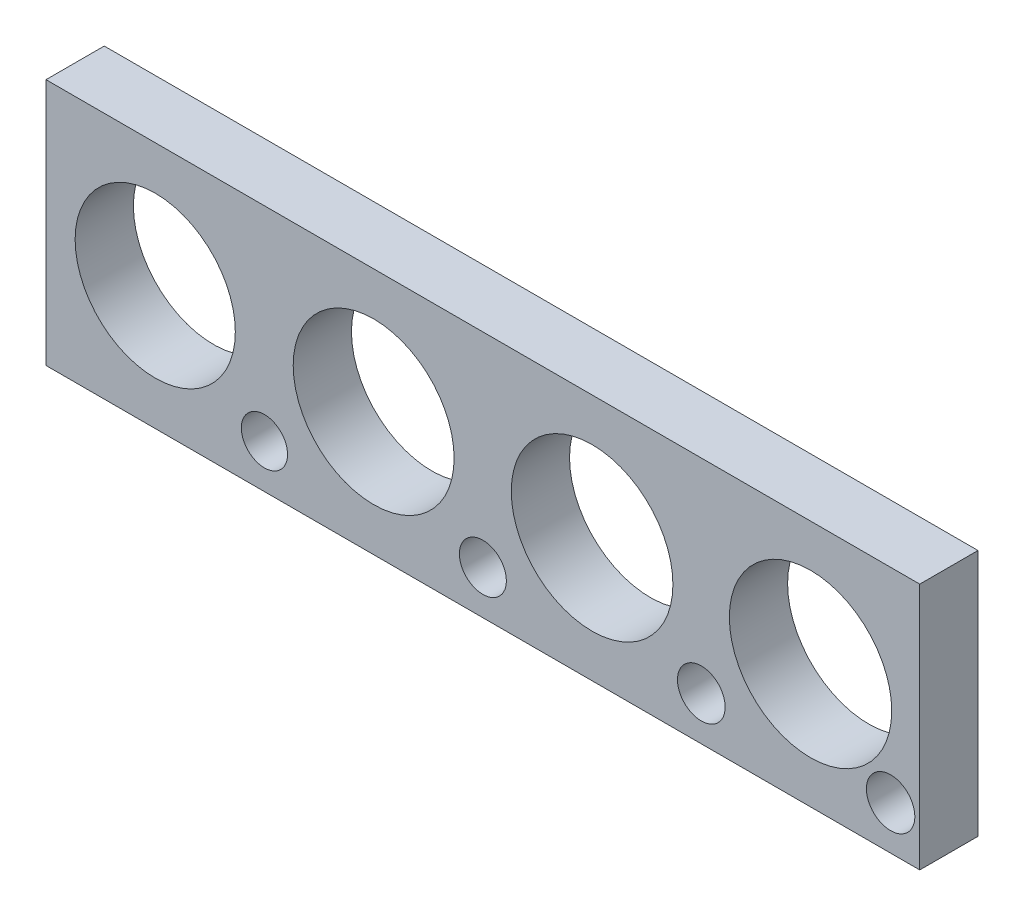
ISO-10303-21;
HEADER;
FILE_DESCRIPTION(('STEP AP214'),'2;1');
FILE_NAME('part.step','',(''),(''),'','','');
FILE_SCHEMA(('AUTOMOTIVE_DESIGN { 1 0 10303 214 1 1 1 1 }'));
ENDSEC;
DATA;
#1=APPLICATION_CONTEXT('core data for automotive mechanical design processes');
#2=APPLICATION_PROTOCOL_DEFINITION('international standard','automotive_design',2000,#1);
#3=PRODUCT_CONTEXT('',#1,'mechanical');
#4=PRODUCT('Part','Part','',(#3));
#5=PRODUCT_RELATED_PRODUCT_CATEGORY('part','',(#4));
#6=PRODUCT_DEFINITION_FORMATION('','',#4);
#7=PRODUCT_DEFINITION_CONTEXT('part definition',#1,'design');
#8=PRODUCT_DEFINITION('design','',#6,#7);
#9=PRODUCT_DEFINITION_SHAPE('','',#8);
#10=(LENGTH_UNIT() NAMED_UNIT(*) SI_UNIT(.MILLI.,.METRE.));
#11=(NAMED_UNIT(*) PLANE_ANGLE_UNIT() SI_UNIT($,.RADIAN.));
#12=(NAMED_UNIT(*) SI_UNIT($,.STERADIAN.) SOLID_ANGLE_UNIT());
#13=UNCERTAINTY_MEASURE_WITH_UNIT(LENGTH_MEASURE(1.E-05),#10,'distance_accuracy_value','');
#14=(GEOMETRIC_REPRESENTATION_CONTEXT(3) GLOBAL_UNCERTAINTY_ASSIGNED_CONTEXT((#13)) GLOBAL_UNIT_ASSIGNED_CONTEXT((#10,
#11,#12)) REPRESENTATION_CONTEXT('',''));
#15=CARTESIAN_POINT('',(0.,0.,0.));
#16=DIRECTION('',(0.,0.,1.));
#17=DIRECTION('',(1.,0.,0.));
#18=AXIS2_PLACEMENT_3D('',#15,#16,#17);
#19=CARTESIAN_POINT('',(-60.,-17.,8.));
#20=DIRECTION('',(1.,0.,0.));
#21=DIRECTION('',(0.,0.,-1.));
#22=AXIS2_PLACEMENT_3D('',#19,#20,#21);
#23=PLANE('',#22);
#24=DIRECTION('',(0.,-1.,0.));
#25=VECTOR('',#24,1.);
#26=CARTESIAN_POINT('',(-60.,-17.,0.));
#27=LINE('',#26,#25);
#28=CARTESIAN_POINT('',(-60.,17.,0.));
#29=VERTEX_POINT('',#28);
#30=CARTESIAN_POINT('',(-60.,-17.,0.));
#31=VERTEX_POINT('',#30);
#32=EDGE_CURVE('E116',#29,#31,#27,.T.);
#33=ORIENTED_EDGE('',*,*,#32,.T.);
#34=DIRECTION('',(0.,0.,-1.));
#35=VECTOR('',#34,1.);
#36=CARTESIAN_POINT('',(-60.,-17.,8.));
#37=LINE('',#36,#35);
#38=CARTESIAN_POINT('',(-60.,-17.,8.));
#39=VERTEX_POINT('',#38);
#40=EDGE_CURVE('E11',#39,#31,#37,.T.);
#41=ORIENTED_EDGE('',*,*,#40,.F.);
#42=DIRECTION('',(0.,-1.,0.));
#43=VECTOR('',#42,1.);
#44=CARTESIAN_POINT('',(-60.,-17.,8.));
#45=LINE('',#44,#43);
#46=CARTESIAN_POINT('',(-60.,17.,8.));
#47=VERTEX_POINT('',#46);
#48=EDGE_CURVE('E97',#47,#39,#45,.T.);
#49=ORIENTED_EDGE('',*,*,#48,.F.);
#50=DIRECTION('',(0.,0.,-1.));
#51=VECTOR('',#50,1.);
#52=CARTESIAN_POINT('',(-60.,17.,8.));
#53=LINE('',#52,#51);
#54=EDGE_CURVE('E115',#47,#29,#53,.T.);
#55=ORIENTED_EDGE('',*,*,#54,.T.);
#56=EDGE_LOOP('',(#33,#41,#49,#55));
#57=FACE_BOUND('',#56,.T.);
#58=ADVANCED_FACE('F44',(#57),#23,.F.);
#59=CARTESIAN_POINT('',(-60.,-17.,8.));
#60=DIRECTION('',(0.,1.,0.));
#61=DIRECTION('',(0.,0.,1.));
#62=AXIS2_PLACEMENT_3D('',#59,#60,#61);
#63=PLANE('',#62);
#64=DIRECTION('',(1.,0.,0.));
#65=VECTOR('',#64,1.);
#66=CARTESIAN_POINT('',(-60.,-17.,0.));
#67=LINE('',#66,#65);
#68=CARTESIAN_POINT('',(60.,-17.,0.));
#69=VERTEX_POINT('',#68);
#70=EDGE_CURVE('E102',#31,#69,#67,.T.);
#71=ORIENTED_EDGE('',*,*,#70,.T.);
#72=DIRECTION('',(0.,0.,-1.));
#73=VECTOR('',#72,1.);
#74=CARTESIAN_POINT('',(60.,-17.,8.));
#75=LINE('',#74,#73);
#76=CARTESIAN_POINT('',(60.,-17.,8.));
#77=VERTEX_POINT('',#76);
#78=EDGE_CURVE('E54',#77,#69,#75,.T.);
#79=ORIENTED_EDGE('',*,*,#78,.F.);
#80=DIRECTION('',(1.,0.,0.));
#81=VECTOR('',#80,1.);
#82=CARTESIAN_POINT('',(-60.,-17.,8.));
#83=LINE('',#82,#81);
#84=EDGE_CURVE('E94',#39,#77,#83,.T.);
#85=ORIENTED_EDGE('',*,*,#84,.F.);
#86=ORIENTED_EDGE('',*,*,#40,.T.);
#87=EDGE_LOOP('',(#71,#79,#85,#86));
#88=FACE_BOUND('',#87,.T.);
#89=ADVANCED_FACE('F103',(#88),#63,.F.);
#90=CARTESIAN_POINT('',(60.,-17.,8.));
#91=DIRECTION('',(-1.,0.,0.));
#92=DIRECTION('',(0.,0.,1.));
#93=AXIS2_PLACEMENT_3D('',#90,#91,#92);
#94=PLANE('',#93);
#95=DIRECTION('',(0.,1.,0.));
#96=VECTOR('',#95,1.);
#97=CARTESIAN_POINT('',(60.,-17.,0.));
#98=LINE('',#97,#96);
#99=CARTESIAN_POINT('',(60.,17.,0.));
#100=VERTEX_POINT('',#99);
#101=EDGE_CURVE('E83',#69,#100,#98,.T.);
#102=ORIENTED_EDGE('',*,*,#101,.T.);
#103=DIRECTION('',(0.,0.,-1.));
#104=VECTOR('',#103,1.);
#105=CARTESIAN_POINT('',(60.,17.,8.));
#106=LINE('',#105,#104);
#107=CARTESIAN_POINT('',(60.,17.,8.));
#108=VERTEX_POINT('',#107);
#109=EDGE_CURVE('E106',#108,#100,#106,.T.);
#110=ORIENTED_EDGE('',*,*,#109,.F.);
#111=DIRECTION('',(0.,1.,0.));
#112=VECTOR('',#111,1.);
#113=CARTESIAN_POINT('',(60.,-17.,8.));
#114=LINE('',#113,#112);
#115=EDGE_CURVE('E100',#77,#108,#114,.T.);
#116=ORIENTED_EDGE('',*,*,#115,.F.);
#117=ORIENTED_EDGE('',*,*,#78,.T.);
#118=EDGE_LOOP('',(#102,#110,#116,#117));
#119=FACE_BOUND('',#118,.T.);
#120=ADVANCED_FACE('F107',(#119),#94,.F.);
#121=CARTESIAN_POINT('',(-60.,17.,8.));
#122=DIRECTION('',(0.,-1.,0.));
#123=DIRECTION('',(0.,0.,-1.));
#124=AXIS2_PLACEMENT_3D('',#121,#122,#123);
#125=PLANE('',#124);
#126=DIRECTION('',(-1.,0.,0.));
#127=VECTOR('',#126,1.);
#128=CARTESIAN_POINT('',(-60.,17.,0.));
#129=LINE('',#128,#127);
#130=EDGE_CURVE('E87',#100,#29,#129,.T.);
#131=ORIENTED_EDGE('',*,*,#130,.T.);
#132=ORIENTED_EDGE('',*,*,#54,.F.);
#133=DIRECTION('',(-1.,0.,0.));
#134=VECTOR('',#133,1.);
#135=CARTESIAN_POINT('',(-60.,17.,8.));
#136=LINE('',#135,#134);
#137=EDGE_CURVE('E63',#108,#47,#136,.T.);
#138=ORIENTED_EDGE('',*,*,#137,.F.);
#139=ORIENTED_EDGE('',*,*,#109,.T.);
#140=EDGE_LOOP('',(#131,#132,#138,#139));
#141=FACE_BOUND('',#140,.T.);
#142=ADVANCED_FACE('F206',(#141),#125,.F.);
#143=CARTESIAN_POINT('',(0.,0.,8.));
#144=DIRECTION('',(0.,0.,-1.));
#145=DIRECTION('',(-1.,0.,0.));
#146=AXIS2_PLACEMENT_3D('',#143,#144,#145);
#147=PLANE('',#146);
#148=CARTESIAN_POINT('',(-30.,-11.,8.));
#149=DIRECTION('',(0.,0.,1.));
#150=DIRECTION('',(1.,0.,0.));
#151=AXIS2_PLACEMENT_3D('',#148,#149,#150);
#152=CIRCLE('',#151,3.175);
#153=CARTESIAN_POINT('',(-26.825,-11.,8.));
#154=VERTEX_POINT('',#153);
#155=EDGE_CURVE('E155',#154,#154,#152,.T.);
#156=ORIENTED_EDGE('',*,*,#155,.F.);
#157=EDGE_LOOP('',(#156));
#158=FACE_BOUND('',#157,.T.);
#159=CARTESIAN_POINT('',(0.,-11.,8.));
#160=DIRECTION('',(0.,0.,1.));
#161=DIRECTION('',(1.,0.,0.));
#162=AXIS2_PLACEMENT_3D('',#159,#160,#161);
#163=CIRCLE('',#162,3.225);
#164=CARTESIAN_POINT('',(3.225,-11.,8.));
#165=VERTEX_POINT('',#164);
#166=EDGE_CURVE('E191',#165,#165,#163,.T.);
#167=ORIENTED_EDGE('',*,*,#166,.F.);
#168=EDGE_LOOP('',(#167));
#169=FACE_BOUND('',#168,.T.);
#170=CARTESIAN_POINT('',(30.,-11.,8.));
#171=DIRECTION('',(0.,0.,1.));
#172=DIRECTION('',(1.,0.,0.));
#173=AXIS2_PLACEMENT_3D('',#170,#171,#172);
#174=CIRCLE('',#173,3.275);
#175=CARTESIAN_POINT('',(33.275,-11.,8.));
#176=VERTEX_POINT('',#175);
#177=EDGE_CURVE('E188',#176,#176,#174,.T.);
#178=ORIENTED_EDGE('',*,*,#177,.F.);
#179=EDGE_LOOP('',(#178));
#180=FACE_BOUND('',#179,.T.);
#181=CARTESIAN_POINT('',(56.,-11.,8.));
#182=DIRECTION('',(0.,0.,1.));
#183=DIRECTION('',(1.,0.,0.));
#184=AXIS2_PLACEMENT_3D('',#181,#182,#183);
#185=CIRCLE('',#184,3.325);
#186=CARTESIAN_POINT('',(59.325,-11.,8.));
#187=VERTEX_POINT('',#186);
#188=EDGE_CURVE('E183',#187,#187,#185,.T.);
#189=ORIENTED_EDGE('',*,*,#188,.F.);
#190=EDGE_LOOP('',(#189));
#191=FACE_BOUND('',#190,.T.);
#192=CARTESIAN_POINT('',(-45.,0.,8.));
#193=DIRECTION('',(0.,0.,1.));
#194=DIRECTION('',(1.,0.,0.));
#195=AXIS2_PLACEMENT_3D('',#192,#193,#194);
#196=CIRCLE('',#195,11.);
#197=CARTESIAN_POINT('',(-34.,0.,8.));
#198=VERTEX_POINT('',#197);
#199=EDGE_CURVE('E138',#198,#198,#196,.T.);
#200=ORIENTED_EDGE('',*,*,#199,.F.);
#201=EDGE_LOOP('',(#200));
#202=FACE_BOUND('',#201,.T.);
#203=CARTESIAN_POINT('',(-15.,0.,8.));
#204=DIRECTION('',(0.,0.,1.));
#205=DIRECTION('',(1.,0.,0.));
#206=AXIS2_PLACEMENT_3D('',#203,#204,#205);
#207=CIRCLE('',#206,11.05);
#208=CARTESIAN_POINT('',(-3.95,0.,8.));
#209=VERTEX_POINT('',#208);
#210=EDGE_CURVE('E172',#209,#209,#207,.T.);
#211=ORIENTED_EDGE('',*,*,#210,.F.);
#212=EDGE_LOOP('',(#211));
#213=FACE_BOUND('',#212,.T.);
#214=CARTESIAN_POINT('',(15.,0.,8.));
#215=DIRECTION('',(0.,0.,1.));
#216=DIRECTION('',(1.,0.,0.));
#217=AXIS2_PLACEMENT_3D('',#214,#215,#216);
#218=CIRCLE('',#217,11.1);
#219=CARTESIAN_POINT('',(26.1,0.,8.));
#220=VERTEX_POINT('',#219);
#221=EDGE_CURVE('E170',#220,#220,#218,.T.);
#222=ORIENTED_EDGE('',*,*,#221,.F.);
#223=EDGE_LOOP('',(#222));
#224=FACE_BOUND('',#223,.T.);
#225=CARTESIAN_POINT('',(45.,0.,8.));
#226=DIRECTION('',(0.,0.,1.));
#227=DIRECTION('',(1.,0.,0.));
#228=AXIS2_PLACEMENT_3D('',#225,#226,#227);
#229=CIRCLE('',#228,11.15);
#230=CARTESIAN_POINT('',(56.15,0.,8.));
#231=VERTEX_POINT('',#230);
#232=EDGE_CURVE('E165',#231,#231,#229,.T.);
#233=ORIENTED_EDGE('',*,*,#232,.F.);
#234=EDGE_LOOP('',(#233));
#235=FACE_BOUND('',#234,.T.);
#236=ORIENTED_EDGE('',*,*,#48,.T.);
#237=ORIENTED_EDGE('',*,*,#84,.T.);
#238=ORIENTED_EDGE('',*,*,#115,.T.);
#239=ORIENTED_EDGE('',*,*,#137,.T.);
#240=EDGE_LOOP('',(#236,#237,#238,#239));
#241=FACE_BOUND('',#240,.T.);
#242=ADVANCED_FACE('F92',(#158,#169,#180,#191,#202,#213,#224,#235,#241),#147,.F.);
#243=CARTESIAN_POINT('',(0.,0.,0.));
#244=DIRECTION('',(0.,0.,-1.));
#245=DIRECTION('',(-1.,0.,0.));
#246=AXIS2_PLACEMENT_3D('',#243,#244,#245);
#247=PLANE('',#246);
#248=CARTESIAN_POINT('',(-30.,-11.,0.));
#249=DIRECTION('',(0.,0.,-1.));
#250=DIRECTION('',(-1.,0.,0.));
#251=AXIS2_PLACEMENT_3D('',#248,#249,#250);
#252=CIRCLE('',#251,3.175);
#253=CARTESIAN_POINT('',(-33.175,-11.,0.));
#254=VERTEX_POINT('',#253);
#255=EDGE_CURVE('E48',#254,#254,#252,.F.);
#256=ORIENTED_EDGE('',*,*,#255,.T.);
#257=EDGE_LOOP('',(#256));
#258=FACE_BOUND('',#257,.T.);
#259=CARTESIAN_POINT('',(0.,-11.,0.));
#260=DIRECTION('',(0.,0.,-1.));
#261=DIRECTION('',(-1.,0.,0.));
#262=AXIS2_PLACEMENT_3D('',#259,#260,#261);
#263=CIRCLE('',#262,3.225);
#264=CARTESIAN_POINT('',(-3.225,-11.,0.));
#265=VERTEX_POINT('',#264);
#266=EDGE_CURVE('E154',#265,#265,#263,.F.);
#267=ORIENTED_EDGE('',*,*,#266,.T.);
#268=EDGE_LOOP('',(#267));
#269=FACE_BOUND('',#268,.T.);
#270=CARTESIAN_POINT('',(30.,-11.,0.));
#271=DIRECTION('',(0.,0.,-1.));
#272=DIRECTION('',(-1.,0.,0.));
#273=AXIS2_PLACEMENT_3D('',#270,#271,#272);
#274=CIRCLE('',#273,3.275);
#275=CARTESIAN_POINT('',(26.725,-11.,0.));
#276=VERTEX_POINT('',#275);
#277=EDGE_CURVE('E151',#276,#276,#274,.F.);
#278=ORIENTED_EDGE('',*,*,#277,.T.);
#279=EDGE_LOOP('',(#278));
#280=FACE_BOUND('',#279,.T.);
#281=CARTESIAN_POINT('',(56.,-11.,0.));
#282=DIRECTION('',(0.,0.,-1.));
#283=DIRECTION('',(-1.,0.,0.));
#284=AXIS2_PLACEMENT_3D('',#281,#282,#283);
#285=CIRCLE('',#284,3.325);
#286=CARTESIAN_POINT('',(52.675,-11.,0.));
#287=VERTEX_POINT('',#286);
#288=EDGE_CURVE('E150',#287,#287,#285,.F.);
#289=ORIENTED_EDGE('',*,*,#288,.T.);
#290=EDGE_LOOP('',(#289));
#291=FACE_BOUND('',#290,.T.);
#292=CARTESIAN_POINT('',(-45.,0.,0.));
#293=DIRECTION('',(0.,0.,-1.));
#294=DIRECTION('',(-1.,0.,0.));
#295=AXIS2_PLACEMENT_3D('',#292,#293,#294);
#296=CIRCLE('',#295,11.);
#297=CARTESIAN_POINT('',(-56.,0.,0.));
#298=VERTEX_POINT('',#297);
#299=EDGE_CURVE('E119',#298,#298,#296,.F.);
#300=ORIENTED_EDGE('',*,*,#299,.T.);
#301=EDGE_LOOP('',(#300));
#302=FACE_BOUND('',#301,.T.);
#303=CARTESIAN_POINT('',(-15.,0.,0.));
#304=DIRECTION('',(0.,0.,-1.));
#305=DIRECTION('',(-1.,0.,0.));
#306=AXIS2_PLACEMENT_3D('',#303,#304,#305);
#307=CIRCLE('',#306,11.05);
#308=CARTESIAN_POINT('',(-26.05,0.,0.));
#309=VERTEX_POINT('',#308);
#310=EDGE_CURVE('E137',#309,#309,#307,.F.);
#311=ORIENTED_EDGE('',*,*,#310,.T.);
#312=EDGE_LOOP('',(#311));
#313=FACE_BOUND('',#312,.T.);
#314=CARTESIAN_POINT('',(15.,0.,0.));
#315=DIRECTION('',(0.,0.,-1.));
#316=DIRECTION('',(-1.,0.,0.));
#317=AXIS2_PLACEMENT_3D('',#314,#315,#316);
#318=CIRCLE('',#317,11.1);
#319=CARTESIAN_POINT('',(3.9,0.,0.));
#320=VERTEX_POINT('',#319);
#321=EDGE_CURVE('E134',#320,#320,#318,.F.);
#322=ORIENTED_EDGE('',*,*,#321,.T.);
#323=EDGE_LOOP('',(#322));
#324=FACE_BOUND('',#323,.T.);
#325=CARTESIAN_POINT('',(45.,0.,0.));
#326=DIRECTION('',(0.,0.,-1.));
#327=DIRECTION('',(-1.,0.,0.));
#328=AXIS2_PLACEMENT_3D('',#325,#326,#327);
#329=CIRCLE('',#328,11.15);
#330=CARTESIAN_POINT('',(33.85,0.,0.));
#331=VERTEX_POINT('',#330);
#332=EDGE_CURVE('E131',#331,#331,#329,.F.);
#333=ORIENTED_EDGE('',*,*,#332,.T.);
#334=EDGE_LOOP('',(#333));
#335=FACE_BOUND('',#334,.T.);
#336=ORIENTED_EDGE('',*,*,#32,.F.);
#337=ORIENTED_EDGE('',*,*,#130,.F.);
#338=ORIENTED_EDGE('',*,*,#101,.F.);
#339=ORIENTED_EDGE('',*,*,#70,.F.);
#340=EDGE_LOOP('',(#336,#337,#338,#339));
#341=FACE_BOUND('',#340,.T.);
#342=ADVANCED_FACE('F202',(#258,#269,#280,#291,#302,#313,#324,#335,#341),#247,.T.);
#343=CARTESIAN_POINT('',(45.,0.,8.));
#344=DIRECTION('',(0.,0.,-1.));
#345=DIRECTION('',(-1.,0.,0.));
#346=AXIS2_PLACEMENT_3D('',#343,#344,#345);
#347=CYLINDRICAL_SURFACE('',#346,11.15);
#348=ORIENTED_EDGE('',*,*,#332,.F.);
#349=EDGE_LOOP('',(#348));
#350=FACE_BOUND('',#349,.T.);
#351=ORIENTED_EDGE('',*,*,#232,.T.);
#352=EDGE_LOOP('',(#351));
#353=FACE_BOUND('',#352,.T.);
#354=ADVANCED_FACE('F224',(#350,#353),#347,.F.);
#355=CARTESIAN_POINT('',(15.,0.,8.));
#356=DIRECTION('',(0.,0.,-1.));
#357=DIRECTION('',(-1.,0.,0.));
#358=AXIS2_PLACEMENT_3D('',#355,#356,#357);
#359=CYLINDRICAL_SURFACE('',#358,11.1);
#360=ORIENTED_EDGE('',*,*,#321,.F.);
#361=EDGE_LOOP('',(#360));
#362=FACE_BOUND('',#361,.T.);
#363=ORIENTED_EDGE('',*,*,#221,.T.);
#364=EDGE_LOOP('',(#363));
#365=FACE_BOUND('',#364,.T.);
#366=ADVANCED_FACE('F219',(#362,#365),#359,.F.);
#367=CARTESIAN_POINT('',(-15.,0.,8.));
#368=DIRECTION('',(0.,0.,-1.));
#369=DIRECTION('',(-1.,0.,0.));
#370=AXIS2_PLACEMENT_3D('',#367,#368,#369);
#371=CYLINDRICAL_SURFACE('',#370,11.05);
#372=ORIENTED_EDGE('',*,*,#310,.F.);
#373=EDGE_LOOP('',(#372));
#374=FACE_BOUND('',#373,.T.);
#375=ORIENTED_EDGE('',*,*,#210,.T.);
#376=EDGE_LOOP('',(#375));
#377=FACE_BOUND('',#376,.T.);
#378=ADVANCED_FACE('F225',(#374,#377),#371,.F.);
#379=CARTESIAN_POINT('',(-45.,0.,8.));
#380=DIRECTION('',(0.,0.,-1.));
#381=DIRECTION('',(-1.,0.,0.));
#382=AXIS2_PLACEMENT_3D('',#379,#380,#381);
#383=CYLINDRICAL_SURFACE('',#382,11.);
#384=ORIENTED_EDGE('',*,*,#299,.F.);
#385=EDGE_LOOP('',(#384));
#386=FACE_BOUND('',#385,.T.);
#387=ORIENTED_EDGE('',*,*,#199,.T.);
#388=EDGE_LOOP('',(#387));
#389=FACE_BOUND('',#388,.T.);
#390=ADVANCED_FACE('F229',(#386,#389),#383,.F.);
#391=CARTESIAN_POINT('',(56.,-11.,8.));
#392=DIRECTION('',(0.,0.,-1.));
#393=DIRECTION('',(-1.,0.,0.));
#394=AXIS2_PLACEMENT_3D('',#391,#392,#393);
#395=CYLINDRICAL_SURFACE('',#394,3.325);
#396=ORIENTED_EDGE('',*,*,#288,.F.);
#397=EDGE_LOOP('',(#396));
#398=FACE_BOUND('',#397,.T.);
#399=ORIENTED_EDGE('',*,*,#188,.T.);
#400=EDGE_LOOP('',(#399));
#401=FACE_BOUND('',#400,.T.);
#402=ADVANCED_FACE('F287',(#398,#401),#395,.F.);
#403=CARTESIAN_POINT('',(30.,-11.,8.));
#404=DIRECTION('',(0.,0.,-1.));
#405=DIRECTION('',(-1.,0.,0.));
#406=AXIS2_PLACEMENT_3D('',#403,#404,#405);
#407=CYLINDRICAL_SURFACE('',#406,3.275);
#408=ORIENTED_EDGE('',*,*,#277,.F.);
#409=EDGE_LOOP('',(#408));
#410=FACE_BOUND('',#409,.T.);
#411=ORIENTED_EDGE('',*,*,#177,.T.);
#412=EDGE_LOOP('',(#411));
#413=FACE_BOUND('',#412,.T.);
#414=ADVANCED_FACE('F298',(#410,#413),#407,.F.);
#415=CARTESIAN_POINT('',(0.,-11.,8.));
#416=DIRECTION('',(0.,0.,-1.));
#417=DIRECTION('',(-1.,0.,0.));
#418=AXIS2_PLACEMENT_3D('',#415,#416,#417);
#419=CYLINDRICAL_SURFACE('',#418,3.225);
#420=ORIENTED_EDGE('',*,*,#266,.F.);
#421=EDGE_LOOP('',(#420));
#422=FACE_BOUND('',#421,.T.);
#423=ORIENTED_EDGE('',*,*,#166,.T.);
#424=EDGE_LOOP('',(#423));
#425=FACE_BOUND('',#424,.T.);
#426=ADVANCED_FACE('F310',(#422,#425),#419,.F.);
#427=CARTESIAN_POINT('',(-30.,-11.,8.));
#428=DIRECTION('',(0.,0.,-1.));
#429=DIRECTION('',(-1.,0.,0.));
#430=AXIS2_PLACEMENT_3D('',#427,#428,#429);
#431=CYLINDRICAL_SURFACE('',#430,3.175);
#432=ORIENTED_EDGE('',*,*,#255,.F.);
#433=EDGE_LOOP('',(#432));
#434=FACE_BOUND('',#433,.T.);
#435=ORIENTED_EDGE('',*,*,#155,.T.);
#436=EDGE_LOOP('',(#435));
#437=FACE_BOUND('',#436,.T.);
#438=ADVANCED_FACE('F203',(#434,#437),#431,.F.);
#439=CLOSED_SHELL('',(#58,#89,#120,#142,#242,#342,#354,#366,#378,#390,#402,#414,#426,#438));
#440=MANIFOLD_SOLID_BREP('B2',#439);
#441=ADVANCED_BREP_SHAPE_REPRESENTATION('',(#18,#440),#14);
#442=SHAPE_DEFINITION_REPRESENTATION(#9,#441);
ENDSEC;
END-ISO-10303-21;
